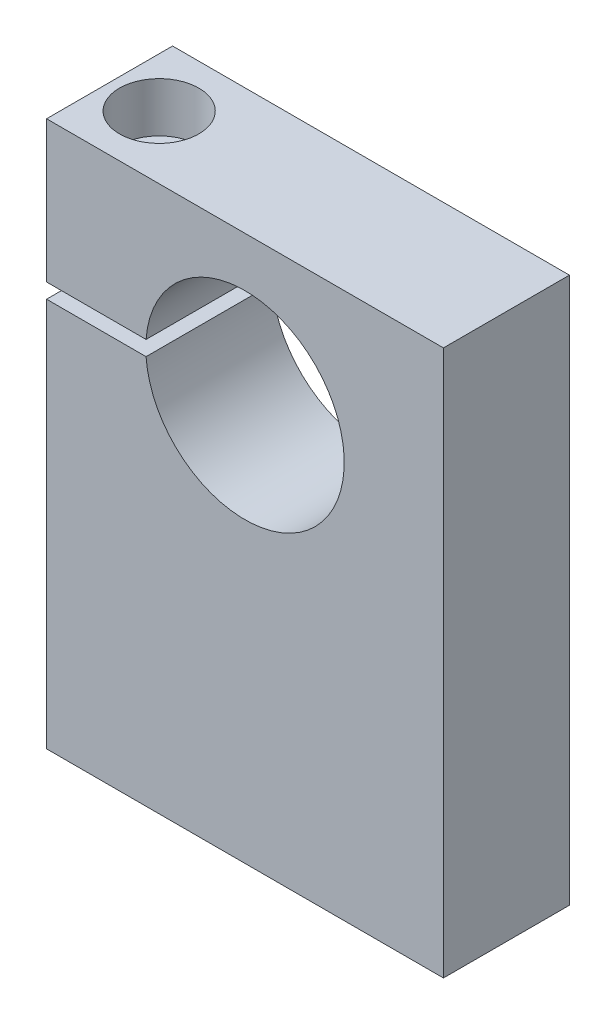
ISO-10303-21;
HEADER;
FILE_DESCRIPTION(('STEP AP214'),'2;1');
FILE_NAME('part.step','',(''),(''),'','','');
FILE_SCHEMA(('AUTOMOTIVE_DESIGN { 1 0 10303 214 1 1 1 1 }'));
ENDSEC;
DATA;
#1=APPLICATION_CONTEXT('core data for automotive mechanical design processes');
#2=APPLICATION_PROTOCOL_DEFINITION('international standard','automotive_design',2000,#1);
#3=PRODUCT_CONTEXT('',#1,'mechanical');
#4=PRODUCT('Part','Part','',(#3));
#5=PRODUCT_RELATED_PRODUCT_CATEGORY('part','',(#4));
#6=PRODUCT_DEFINITION_FORMATION('','',#4);
#7=PRODUCT_DEFINITION_CONTEXT('part definition',#1,'design');
#8=PRODUCT_DEFINITION('design','',#6,#7);
#9=PRODUCT_DEFINITION_SHAPE('','',#8);
#10=(LENGTH_UNIT() NAMED_UNIT(*) SI_UNIT(.MILLI.,.METRE.));
#11=(NAMED_UNIT(*) PLANE_ANGLE_UNIT() SI_UNIT($,.RADIAN.));
#12=(NAMED_UNIT(*) SI_UNIT($,.STERADIAN.) SOLID_ANGLE_UNIT());
#13=UNCERTAINTY_MEASURE_WITH_UNIT(LENGTH_MEASURE(1.E-05),#10,'distance_accuracy_value','');
#14=(GEOMETRIC_REPRESENTATION_CONTEXT(3) GLOBAL_UNCERTAINTY_ASSIGNED_CONTEXT((#13)) GLOBAL_UNIT_ASSIGNED_CONTEXT((#10,
#11,#12)) REPRESENTATION_CONTEXT('',''));
#15=CARTESIAN_POINT('',(0.,0.,0.));
#16=DIRECTION('',(0.,0.,1.));
#17=DIRECTION('',(1.,0.,0.));
#18=AXIS2_PLACEMENT_3D('',#15,#16,#17);
#19=CARTESIAN_POINT('',(-15.0009946638275,-8.00000000000003,6.35));
#20=DIRECTION('',(0.,1.,0.));
#21=DIRECTION('',(-1.,0.,0.));
#22=AXIS2_PLACEMENT_3D('',#19,#20,#21);
#23=CYLINDRICAL_SURFACE('',#22,2.);
#24=CARTESIAN_POINT('',(-15.0009946638275,0.749999999999999,6.35));
#25=DIRECTION('',(0.,1.,0.));
#26=DIRECTION('',(-1.,0.,0.));
#27=AXIS2_PLACEMENT_3D('',#24,#25,#26);
#28=CIRCLE('',#27,2.);
#29=CARTESIAN_POINT('',(-17.0009946638275,0.749999999999999,6.35));
#30=VERTEX_POINT('',#29);
#31=EDGE_CURVE('E160',#30,#30,#28,.T.);
#32=ORIENTED_EDGE('',*,*,#31,.F.);
#33=EDGE_LOOP('',(#32));
#34=FACE_BOUND('',#33,.T.);
#35=CARTESIAN_POINT('',(-15.0009946638275,9.99999999999998,6.35));
#36=DIRECTION('',(0.,1.,0.));
#37=DIRECTION('',(-1.,0.,0.));
#38=AXIS2_PLACEMENT_3D('',#35,#36,#37);
#39=CIRCLE('',#38,2.);
#40=CARTESIAN_POINT('',(-17.0009946638275,9.99999999999998,6.35));
#41=VERTEX_POINT('',#40);
#42=EDGE_CURVE('E39',#41,#41,#39,.F.);
#43=ORIENTED_EDGE('',*,*,#42,.F.);
#44=EDGE_LOOP('',(#43));
#45=FACE_BOUND('',#44,.T.);
#46=ADVANCED_FACE('F35',(#34,#45),#23,.F.);
#47=CARTESIAN_POINT('',(0.,0.,12.7));
#48=DIRECTION('',(0.,0.,-1.));
#49=DIRECTION('',(-1.,0.,0.));
#50=AXIS2_PLACEMENT_3D('',#47,#48,#49);
#51=CYLINDRICAL_SURFACE('',#50,10.);
#52=CARTESIAN_POINT('',(0.,0.,0.));
#53=DIRECTION('',(0.,0.,1.));
#54=DIRECTION('',(1.,0.,0.));
#55=AXIS2_PLACEMENT_3D('',#52,#53,#54);
#56=CIRCLE('',#55,10.);
#57=CARTESIAN_POINT('',(-9.97183533758956,-0.75,0.));
#58=VERTEX_POINT('',#57);
#59=CARTESIAN_POINT('',(-9.97183533758956,0.75,0.));
#60=VERTEX_POINT('',#59);
#61=EDGE_CURVE('E131',#58,#60,#56,.T.);
#62=ORIENTED_EDGE('',*,*,#61,.F.);
#63=DIRECTION('',(0.,0.,-1.));
#64=VECTOR('',#63,1.);
#65=CARTESIAN_POINT('',(-9.97183533758956,-0.75,12.7));
#66=LINE('',#65,#64);
#67=CARTESIAN_POINT('',(-9.97183533758956,-0.75,12.7));
#68=VERTEX_POINT('',#67);
#69=EDGE_CURVE('E11',#68,#58,#66,.T.);
#70=ORIENTED_EDGE('',*,*,#69,.F.);
#71=CARTESIAN_POINT('',(0.,0.,12.7));
#72=DIRECTION('',(0.,0.,1.));
#73=DIRECTION('',(1.,0.,0.));
#74=AXIS2_PLACEMENT_3D('',#71,#72,#73);
#75=CIRCLE('',#74,10.);
#76=CARTESIAN_POINT('',(-9.97183533758956,0.75,12.7));
#77=VERTEX_POINT('',#76);
#78=EDGE_CURVE('E152',#68,#77,#75,.T.);
#79=ORIENTED_EDGE('',*,*,#78,.T.);
#80=DIRECTION('',(0.,0.,-1.));
#81=VECTOR('',#80,1.);
#82=CARTESIAN_POINT('',(-9.97183533758956,0.75,12.7));
#83=LINE('',#82,#81);
#84=EDGE_CURVE('E88',#77,#60,#83,.T.);
#85=ORIENTED_EDGE('',*,*,#84,.T.);
#86=EDGE_LOOP('',(#62,#70,#79,#85));
#87=FACE_BOUND('',#86,.T.);
#88=ADVANCED_FACE('F37',(#87),#51,.F.);
#89=CARTESIAN_POINT('',(0.,-0.75,12.7));
#90=DIRECTION('',(0.,1.,0.));
#91=DIRECTION('',(-1.,0.,0.));
#92=AXIS2_PLACEMENT_3D('',#89,#90,#91);
#93=PLANE('',#92);
#94=CARTESIAN_POINT('',(-15.0009946638275,-0.750000000000001,6.35));
#95=DIRECTION('',(0.,1.,0.));
#96=DIRECTION('',(-1.,0.,0.));
#97=AXIS2_PLACEMENT_3D('',#94,#95,#96);
#98=CIRCLE('',#97,2.);
#99=CARTESIAN_POINT('',(-17.0009946638275,-0.750000000000001,6.35));
#100=VERTEX_POINT('',#99);
#101=EDGE_CURVE('E135',#100,#100,#98,.T.);
#102=ORIENTED_EDGE('',*,*,#101,.F.);
#103=EDGE_LOOP('',(#102));
#104=FACE_BOUND('',#103,.T.);
#105=DIRECTION('',(1.,0.,0.));
#106=VECTOR('',#105,1.);
#107=CARTESIAN_POINT('',(0.,-0.75,0.));
#108=LINE('',#107,#106);
#109=CARTESIAN_POINT('',(-20.,-0.75,0.));
#110=VERTEX_POINT('',#109);
#111=EDGE_CURVE('E134',#110,#58,#108,.T.);
#112=ORIENTED_EDGE('',*,*,#111,.F.);
#113=DIRECTION('',(0.,0.,-1.));
#114=VECTOR('',#113,1.);
#115=CARTESIAN_POINT('',(-20.,-0.75,12.7));
#116=LINE('',#115,#114);
#117=CARTESIAN_POINT('',(-20.,-0.75,12.7));
#118=VERTEX_POINT('',#117);
#119=EDGE_CURVE('E45',#118,#110,#116,.T.);
#120=ORIENTED_EDGE('',*,*,#119,.F.);
#121=DIRECTION('',(1.,0.,0.));
#122=VECTOR('',#121,1.);
#123=CARTESIAN_POINT('',(0.,-0.75,12.7));
#124=LINE('',#123,#122);
#125=EDGE_CURVE('E178',#118,#68,#124,.T.);
#126=ORIENTED_EDGE('',*,*,#125,.T.);
#127=ORIENTED_EDGE('',*,*,#69,.T.);
#128=EDGE_LOOP('',(#112,#120,#126,#127));
#129=FACE_BOUND('',#128,.T.);
#130=ADVANCED_FACE('F197',(#104,#129),#93,.T.);
#131=CARTESIAN_POINT('',(-20.,0.,12.7));
#132=DIRECTION('',(-1.,0.,0.));
#133=DIRECTION('',(0.,-1.,0.));
#134=AXIS2_PLACEMENT_3D('',#131,#132,#133);
#135=PLANE('',#134);
#136=DIRECTION('',(0.,1.,0.));
#137=VECTOR('',#136,1.);
#138=CARTESIAN_POINT('',(-20.,0.,0.));
#139=LINE('',#138,#137);
#140=CARTESIAN_POINT('',(-20.,-40.,0.));
#141=VERTEX_POINT('',#140);
#142=EDGE_CURVE('E138',#141,#110,#139,.T.);
#143=ORIENTED_EDGE('',*,*,#142,.F.);
#144=DIRECTION('',(0.,0.,-1.));
#145=VECTOR('',#144,1.);
#146=CARTESIAN_POINT('',(-20.,-40.,12.7));
#147=LINE('',#146,#145);
#148=CARTESIAN_POINT('',(-20.,-40.,12.7));
#149=VERTEX_POINT('',#148);
#150=EDGE_CURVE('E158',#149,#141,#147,.T.);
#151=ORIENTED_EDGE('',*,*,#150,.F.);
#152=DIRECTION('',(0.,1.,0.));
#153=VECTOR('',#152,1.);
#154=CARTESIAN_POINT('',(-20.,0.,12.7));
#155=LINE('',#154,#153);
#156=EDGE_CURVE('E181',#149,#118,#155,.T.);
#157=ORIENTED_EDGE('',*,*,#156,.T.);
#158=ORIENTED_EDGE('',*,*,#119,.T.);
#159=EDGE_LOOP('',(#143,#151,#157,#158));
#160=FACE_BOUND('',#159,.T.);
#161=ADVANCED_FACE('F200',(#160),#135,.T.);
#162=CARTESIAN_POINT('',(0.,-40.,12.7));
#163=DIRECTION('',(0.,-1.,0.));
#164=DIRECTION('',(1.,0.,0.));
#165=AXIS2_PLACEMENT_3D('',#162,#163,#164);
#166=PLANE('',#165);
#167=CARTESIAN_POINT('',(12.5,-40.,6.35));
#168=DIRECTION('',(0.,-1.,0.));
#169=DIRECTION('',(0.,0.,-1.));
#170=AXIS2_PLACEMENT_3D('',#167,#168,#169);
#171=CIRCLE('',#170,3.96875);
#172=CARTESIAN_POINT('',(12.5,-40.,2.38125));
#173=VERTEX_POINT('',#172);
#174=EDGE_CURVE('E362',#173,#173,#171,.T.);
#175=ORIENTED_EDGE('',*,*,#174,.F.);
#176=EDGE_LOOP('',(#175));
#177=FACE_BOUND('',#176,.T.);
#178=CARTESIAN_POINT('',(-12.5,-40.,6.35));
#179=DIRECTION('',(0.,-1.,0.));
#180=DIRECTION('',(0.,0.,-1.));
#181=AXIS2_PLACEMENT_3D('',#178,#179,#180);
#182=CIRCLE('',#181,3.96875);
#183=CARTESIAN_POINT('',(-12.5,-40.,2.38125));
#184=VERTEX_POINT('',#183);
#185=EDGE_CURVE('E361',#184,#184,#182,.T.);
#186=ORIENTED_EDGE('',*,*,#185,.F.);
#187=EDGE_LOOP('',(#186));
#188=FACE_BOUND('',#187,.T.);
#189=DIRECTION('',(-1.,0.,0.));
#190=VECTOR('',#189,1.);
#191=CARTESIAN_POINT('',(0.,-40.,0.));
#192=LINE('',#191,#190);
#193=CARTESIAN_POINT('',(20.,-40.,0.));
#194=VERTEX_POINT('',#193);
#195=EDGE_CURVE('E141',#194,#141,#192,.T.);
#196=ORIENTED_EDGE('',*,*,#195,.F.);
#197=DIRECTION('',(0.,0.,-1.));
#198=VECTOR('',#197,1.);
#199=CARTESIAN_POINT('',(20.,-40.,12.7));
#200=LINE('',#199,#198);
#201=CARTESIAN_POINT('',(20.,-40.,12.7));
#202=VERTEX_POINT('',#201);
#203=EDGE_CURVE('E156',#202,#194,#200,.T.);
#204=ORIENTED_EDGE('',*,*,#203,.F.);
#205=DIRECTION('',(-1.,0.,0.));
#206=VECTOR('',#205,1.);
#207=CARTESIAN_POINT('',(0.,-40.,12.7));
#208=LINE('',#207,#206);
#209=EDGE_CURVE('E184',#202,#149,#208,.T.);
#210=ORIENTED_EDGE('',*,*,#209,.T.);
#211=ORIENTED_EDGE('',*,*,#150,.T.);
#212=EDGE_LOOP('',(#196,#204,#210,#211));
#213=FACE_BOUND('',#212,.T.);
#214=ADVANCED_FACE('F202',(#177,#188,#213),#166,.T.);
#215=CARTESIAN_POINT('',(20.,0.,12.7));
#216=DIRECTION('',(1.,0.,0.));
#217=DIRECTION('',(0.,1.,0.));
#218=AXIS2_PLACEMENT_3D('',#215,#216,#217);
#219=PLANE('',#218);
#220=DIRECTION('',(0.,-1.,0.));
#221=VECTOR('',#220,1.);
#222=CARTESIAN_POINT('',(20.,0.,0.));
#223=LINE('',#222,#221);
#224=CARTESIAN_POINT('',(20.,15.,0.));
#225=VERTEX_POINT('',#224);
#226=EDGE_CURVE('E144',#225,#194,#223,.T.);
#227=ORIENTED_EDGE('',*,*,#226,.F.);
#228=DIRECTION('',(0.,0.,-1.));
#229=VECTOR('',#228,1.);
#230=CARTESIAN_POINT('',(20.,15.,12.7));
#231=LINE('',#230,#229);
#232=CARTESIAN_POINT('',(20.,15.,12.7));
#233=VERTEX_POINT('',#232);
#234=EDGE_CURVE('E117',#233,#225,#231,.T.);
#235=ORIENTED_EDGE('',*,*,#234,.F.);
#236=DIRECTION('',(0.,-1.,0.));
#237=VECTOR('',#236,1.);
#238=CARTESIAN_POINT('',(20.,0.,12.7));
#239=LINE('',#238,#237);
#240=EDGE_CURVE('E124',#233,#202,#239,.T.);
#241=ORIENTED_EDGE('',*,*,#240,.T.);
#242=ORIENTED_EDGE('',*,*,#203,.T.);
#243=EDGE_LOOP('',(#227,#235,#241,#242));
#244=FACE_BOUND('',#243,.T.);
#245=ADVANCED_FACE('F188',(#244),#219,.T.);
#246=CARTESIAN_POINT('',(0.,15.,12.7));
#247=DIRECTION('',(0.,1.,0.));
#248=DIRECTION('',(-1.,0.,0.));
#249=AXIS2_PLACEMENT_3D('',#246,#247,#248);
#250=PLANE('',#249);
#251=CARTESIAN_POINT('',(-15.0009946638275,15.,6.35));
#252=DIRECTION('',(0.,1.,0.));
#253=DIRECTION('',(-1.,0.,0.));
#254=AXIS2_PLACEMENT_3D('',#251,#252,#253);
#255=CIRCLE('',#254,4.);
#256=CARTESIAN_POINT('',(-19.0009946638275,15.,6.35));
#257=VERTEX_POINT('',#256);
#258=EDGE_CURVE('E174',#257,#257,#255,.T.);
#259=ORIENTED_EDGE('',*,*,#258,.F.);
#260=EDGE_LOOP('',(#259));
#261=FACE_BOUND('',#260,.T.);
#262=DIRECTION('',(1.,0.,0.));
#263=VECTOR('',#262,1.);
#264=CARTESIAN_POINT('',(0.,15.,0.));
#265=LINE('',#264,#263);
#266=CARTESIAN_POINT('',(-20.,15.,0.));
#267=VERTEX_POINT('',#266);
#268=EDGE_CURVE('E112',#267,#225,#265,.T.);
#269=ORIENTED_EDGE('',*,*,#268,.F.);
#270=DIRECTION('',(0.,0.,-1.));
#271=VECTOR('',#270,1.);
#272=CARTESIAN_POINT('',(-20.,15.,12.7));
#273=LINE('',#272,#271);
#274=CARTESIAN_POINT('',(-20.,15.,12.7));
#275=VERTEX_POINT('',#274);
#276=EDGE_CURVE('E107',#275,#267,#273,.T.);
#277=ORIENTED_EDGE('',*,*,#276,.F.);
#278=DIRECTION('',(1.,0.,0.));
#279=VECTOR('',#278,1.);
#280=CARTESIAN_POINT('',(0.,15.,12.7));
#281=LINE('',#280,#279);
#282=EDGE_CURVE('E110',#275,#233,#281,.T.);
#283=ORIENTED_EDGE('',*,*,#282,.T.);
#284=ORIENTED_EDGE('',*,*,#234,.T.);
#285=EDGE_LOOP('',(#269,#277,#283,#284));
#286=FACE_BOUND('',#285,.T.);
#287=ADVANCED_FACE('F109',(#261,#286),#250,.T.);
#288=CARTESIAN_POINT('',(-20.,0.,12.7));
#289=DIRECTION('',(-1.,0.,0.));
#290=DIRECTION('',(0.,-1.,0.));
#291=AXIS2_PLACEMENT_3D('',#288,#289,#290);
#292=PLANE('',#291);
#293=DIRECTION('',(0.,1.,0.));
#294=VECTOR('',#293,1.);
#295=CARTESIAN_POINT('',(-20.,0.,0.));
#296=LINE('',#295,#294);
#297=CARTESIAN_POINT('',(-20.,0.75,0.));
#298=VERTEX_POINT('',#297);
#299=EDGE_CURVE('E148',#298,#267,#296,.T.);
#300=ORIENTED_EDGE('',*,*,#299,.F.);
#301=DIRECTION('',(0.,0.,-1.));
#302=VECTOR('',#301,1.);
#303=CARTESIAN_POINT('',(-20.,0.75,12.7));
#304=LINE('',#303,#302);
#305=CARTESIAN_POINT('',(-20.,0.75,12.7));
#306=VERTEX_POINT('',#305);
#307=EDGE_CURVE('E81',#306,#298,#304,.T.);
#308=ORIENTED_EDGE('',*,*,#307,.F.);
#309=DIRECTION('',(0.,1.,0.));
#310=VECTOR('',#309,1.);
#311=CARTESIAN_POINT('',(-20.,0.,12.7));
#312=LINE('',#311,#310);
#313=EDGE_CURVE('E121',#306,#275,#312,.T.);
#314=ORIENTED_EDGE('',*,*,#313,.T.);
#315=ORIENTED_EDGE('',*,*,#276,.T.);
#316=EDGE_LOOP('',(#300,#308,#314,#315));
#317=FACE_BOUND('',#316,.T.);
#318=ADVANCED_FACE('F126',(#317),#292,.T.);
#319=CARTESIAN_POINT('',(0.,0.75,12.7));
#320=DIRECTION('',(0.,1.,0.));
#321=DIRECTION('',(-1.,0.,0.));
#322=AXIS2_PLACEMENT_3D('',#319,#320,#321);
#323=PLANE('',#322);
#324=ORIENTED_EDGE('',*,*,#31,.T.);
#325=EDGE_LOOP('',(#324));
#326=FACE_BOUND('',#325,.T.);
#327=DIRECTION('',(1.,0.,0.));
#328=VECTOR('',#327,1.);
#329=CARTESIAN_POINT('',(0.,0.75,0.));
#330=LINE('',#329,#328);
#331=EDGE_CURVE('E150',#298,#60,#330,.T.);
#332=ORIENTED_EDGE('',*,*,#331,.T.);
#333=ORIENTED_EDGE('',*,*,#84,.F.);
#334=DIRECTION('',(1.,0.,0.));
#335=VECTOR('',#334,1.);
#336=CARTESIAN_POINT('',(0.,0.75,12.7));
#337=LINE('',#336,#335);
#338=EDGE_CURVE('E54',#306,#77,#337,.T.);
#339=ORIENTED_EDGE('',*,*,#338,.F.);
#340=ORIENTED_EDGE('',*,*,#307,.T.);
#341=EDGE_LOOP('',(#332,#333,#339,#340));
#342=FACE_BOUND('',#341,.T.);
#343=ADVANCED_FACE('F192',(#326,#342),#323,.F.);
#344=CARTESIAN_POINT('',(0.,0.,12.7));
#345=DIRECTION('',(0.,0.,1.));
#346=DIRECTION('',(1.,0.,0.));
#347=AXIS2_PLACEMENT_3D('',#344,#345,#346);
#348=PLANE('',#347);
#349=ORIENTED_EDGE('',*,*,#78,.F.);
#350=ORIENTED_EDGE('',*,*,#125,.F.);
#351=ORIENTED_EDGE('',*,*,#156,.F.);
#352=ORIENTED_EDGE('',*,*,#209,.F.);
#353=ORIENTED_EDGE('',*,*,#240,.F.);
#354=ORIENTED_EDGE('',*,*,#282,.F.);
#355=ORIENTED_EDGE('',*,*,#313,.F.);
#356=ORIENTED_EDGE('',*,*,#338,.T.);
#357=EDGE_LOOP('',(#349,#350,#351,#352,#353,#354,#355,#356));
#358=FACE_BOUND('',#357,.T.);
#359=ADVANCED_FACE('F120',(#358),#348,.T.);
#360=CARTESIAN_POINT('',(0.,0.,0.));
#361=DIRECTION('',(0.,0.,1.));
#362=DIRECTION('',(1.,0.,0.));
#363=AXIS2_PLACEMENT_3D('',#360,#361,#362);
#364=PLANE('',#363);
#365=ORIENTED_EDGE('',*,*,#61,.T.);
#366=ORIENTED_EDGE('',*,*,#331,.F.);
#367=ORIENTED_EDGE('',*,*,#299,.T.);
#368=ORIENTED_EDGE('',*,*,#268,.T.);
#369=ORIENTED_EDGE('',*,*,#226,.T.);
#370=ORIENTED_EDGE('',*,*,#195,.T.);
#371=ORIENTED_EDGE('',*,*,#142,.T.);
#372=ORIENTED_EDGE('',*,*,#111,.T.);
#373=EDGE_LOOP('',(#365,#366,#367,#368,#369,#370,#371,#372));
#374=FACE_BOUND('',#373,.T.);
#375=ADVANCED_FACE('F191',(#374),#364,.F.);
#376=ORIENTED_EDGE('',*,*,#101,.T.);
#377=EDGE_LOOP('',(#376));
#378=FACE_BOUND('',#377,.T.);
#379=CARTESIAN_POINT('',(-15.0009946638275,-8.00000000000003,6.35));
#380=DIRECTION('',(0.,1.,0.));
#381=DIRECTION('',(-1.,0.,0.));
#382=AXIS2_PLACEMENT_3D('',#379,#380,#381);
#383=CIRCLE('',#382,2.);
#384=CARTESIAN_POINT('',(-17.0009946638275,-8.00000000000003,6.35));
#385=VERTEX_POINT('',#384);
#386=EDGE_CURVE('E162',#385,#385,#383,.T.);
#387=ORIENTED_EDGE('',*,*,#386,.F.);
#388=EDGE_LOOP('',(#387));
#389=FACE_BOUND('',#388,.T.);
#390=ADVANCED_FACE('F217',(#378,#389),#23,.F.);
#391=CARTESIAN_POINT('',(-15.0009946638275,-8.00000000000003,6.35));
#392=DIRECTION('',(0.,1.,0.));
#393=DIRECTION('',(-1.,0.,0.));
#394=AXIS2_PLACEMENT_3D('',#391,#392,#393);
#395=PLANE('',#394);
#396=ORIENTED_EDGE('',*,*,#386,.T.);
#397=EDGE_LOOP('',(#396));
#398=FACE_BOUND('',#397,.T.);
#399=ADVANCED_FACE('F225',(#398),#395,.T.);
#400=CARTESIAN_POINT('',(-15.0009946638275,9.99999999999997,6.35));
#401=DIRECTION('',(0.,1.,0.));
#402=DIRECTION('',(-1.,0.,0.));
#403=AXIS2_PLACEMENT_3D('',#400,#401,#402);
#404=PLANE('',#403);
#405=CARTESIAN_POINT('',(-15.0009946638275,9.99999999999997,6.35));
#406=DIRECTION('',(0.,1.,0.));
#407=DIRECTION('',(-1.,0.,0.));
#408=AXIS2_PLACEMENT_3D('',#405,#406,#407);
#409=CIRCLE('',#408,4.);
#410=CARTESIAN_POINT('',(-19.0009946638275,9.99999999999997,6.35));
#411=VERTEX_POINT('',#410);
#412=EDGE_CURVE('E172',#411,#411,#409,.T.);
#413=ORIENTED_EDGE('',*,*,#412,.T.);
#414=EDGE_LOOP('',(#413));
#415=FACE_BOUND('',#414,.T.);
#416=ORIENTED_EDGE('',*,*,#42,.T.);
#417=EDGE_LOOP('',(#416));
#418=FACE_BOUND('',#417,.T.);
#419=ADVANCED_FACE('F231',(#415,#418),#404,.T.);
#420=CARTESIAN_POINT('',(-15.0009946638275,9.99999999999997,6.35));
#421=DIRECTION('',(0.,1.,0.));
#422=DIRECTION('',(-1.,0.,0.));
#423=AXIS2_PLACEMENT_3D('',#420,#421,#422);
#424=CYLINDRICAL_SURFACE('',#423,4.);
#425=ORIENTED_EDGE('',*,*,#412,.F.);
#426=EDGE_LOOP('',(#425));
#427=FACE_BOUND('',#426,.T.);
#428=ORIENTED_EDGE('',*,*,#258,.T.);
#429=EDGE_LOOP('',(#428));
#430=FACE_BOUND('',#429,.T.);
#431=ADVANCED_FACE('F304',(#427,#430),#424,.F.);
#432=CARTESIAN_POINT('',(-12.5,-25.,6.35));
#433=DIRECTION('',(0.,-1.,0.));
#434=DIRECTION('',(0.,0.,-1.));
#435=AXIS2_PLACEMENT_3D('',#432,#433,#434);
#436=CYLINDRICAL_SURFACE('',#435,3.96875);
#437=CARTESIAN_POINT('',(-12.5,-25.,6.35));
#438=DIRECTION('',(0.,-1.,0.));
#439=DIRECTION('',(0.,0.,-1.));
#440=AXIS2_PLACEMENT_3D('',#437,#438,#439);
#441=CIRCLE('',#440,3.96875);
#442=CARTESIAN_POINT('',(-12.5,-25.,2.38125));
#443=VERTEX_POINT('',#442);
#444=EDGE_CURVE('E365',#443,#443,#441,.T.);
#445=ORIENTED_EDGE('',*,*,#444,.F.);
#446=EDGE_LOOP('',(#445));
#447=FACE_BOUND('',#446,.T.);
#448=ORIENTED_EDGE('',*,*,#185,.T.);
#449=EDGE_LOOP('',(#448));
#450=FACE_BOUND('',#449,.T.);
#451=ADVANCED_FACE('F313',(#447,#450),#436,.F.);
#452=CARTESIAN_POINT('',(-12.5,-25.,6.35));
#453=DIRECTION('',(0.,-1.,0.));
#454=DIRECTION('',(0.,0.,-1.));
#455=AXIS2_PLACEMENT_3D('',#452,#453,#454);
#456=PLANE('',#455);
#457=ORIENTED_EDGE('',*,*,#444,.T.);
#458=EDGE_LOOP('',(#457));
#459=FACE_BOUND('',#458,.T.);
#460=ADVANCED_FACE('F322',(#459),#456,.T.);
#461=CARTESIAN_POINT('',(12.5,-25.,6.35));
#462=DIRECTION('',(0.,-1.,0.));
#463=DIRECTION('',(0.,0.,-1.));
#464=AXIS2_PLACEMENT_3D('',#461,#462,#463);
#465=CYLINDRICAL_SURFACE('',#464,3.96875);
#466=CARTESIAN_POINT('',(12.5,-25.,6.35));
#467=DIRECTION('',(0.,-1.,0.));
#468=DIRECTION('',(0.,0.,-1.));
#469=AXIS2_PLACEMENT_3D('',#466,#467,#468);
#470=CIRCLE('',#469,3.96875);
#471=CARTESIAN_POINT('',(12.5,-25.,2.38125));
#472=VERTEX_POINT('',#471);
#473=EDGE_CURVE('E360',#472,#472,#470,.T.);
#474=ORIENTED_EDGE('',*,*,#473,.F.);
#475=EDGE_LOOP('',(#474));
#476=FACE_BOUND('',#475,.T.);
#477=ORIENTED_EDGE('',*,*,#174,.T.);
#478=EDGE_LOOP('',(#477));
#479=FACE_BOUND('',#478,.T.);
#480=ADVANCED_FACE('F331',(#476,#479),#465,.F.);
#481=CARTESIAN_POINT('',(12.5,-25.,6.35));
#482=DIRECTION('',(0.,-1.,0.));
#483=DIRECTION('',(0.,0.,-1.));
#484=AXIS2_PLACEMENT_3D('',#481,#482,#483);
#485=PLANE('',#484);
#486=ORIENTED_EDGE('',*,*,#473,.T.);
#487=EDGE_LOOP('',(#486));
#488=FACE_BOUND('',#487,.T.);
#489=ADVANCED_FACE('F340',(#488),#485,.T.);
#490=CLOSED_SHELL('',(#46,#88,#130,#161,#214,#245,#287,#318,#343,#359,#375,#390,#399,#419,#431,
#451,#460,#480,#489));
#491=MANIFOLD_SOLID_BREP('B2',#490);
#492=ADVANCED_BREP_SHAPE_REPRESENTATION('',(#18,#491),#14);
#493=SHAPE_DEFINITION_REPRESENTATION(#9,#492);
ENDSEC;
END-ISO-10303-21;
